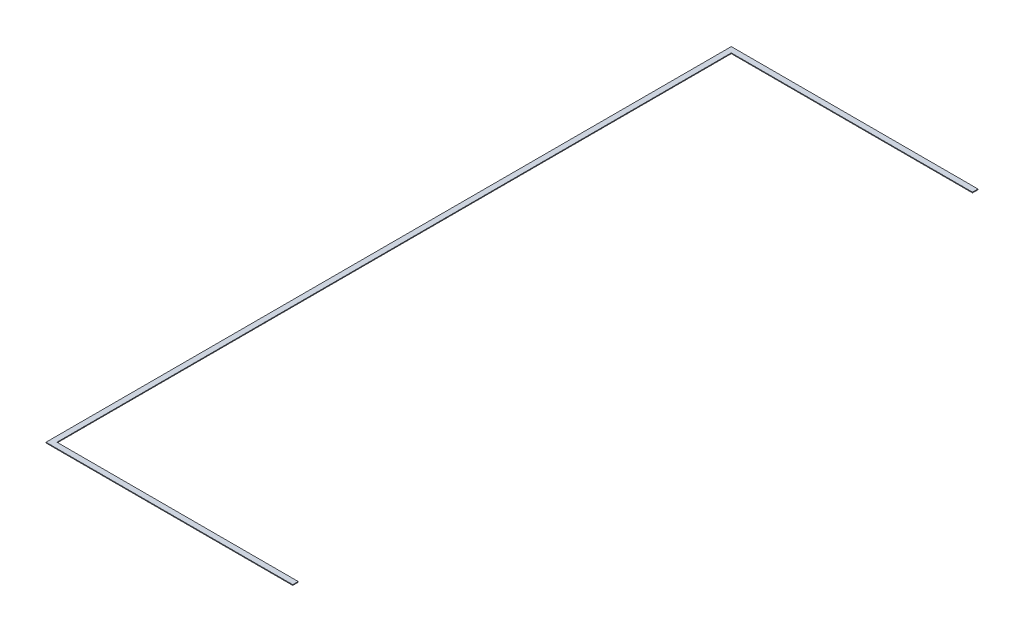
ISO-10303-21;
HEADER;
FILE_DESCRIPTION(('STEP AP214'),'2;1');
FILE_NAME('part.step','',(''),(''),'','','');
FILE_SCHEMA(('AUTOMOTIVE_DESIGN { 1 0 10303 214 1 1 1 1 }'));
ENDSEC;
DATA;
#1=APPLICATION_CONTEXT('core data for automotive mechanical design processes');
#2=APPLICATION_PROTOCOL_DEFINITION('international standard','automotive_design',2000,#1);
#3=PRODUCT_CONTEXT('',#1,'mechanical');
#4=PRODUCT('Part','Part','',(#3));
#5=PRODUCT_RELATED_PRODUCT_CATEGORY('part','',(#4));
#6=PRODUCT_DEFINITION_FORMATION('','',#4);
#7=PRODUCT_DEFINITION_CONTEXT('part definition',#1,'design');
#8=PRODUCT_DEFINITION('design','',#6,#7);
#9=PRODUCT_DEFINITION_SHAPE('','',#8);
#10=(LENGTH_UNIT() NAMED_UNIT(*) SI_UNIT(.MILLI.,.METRE.));
#11=(NAMED_UNIT(*) PLANE_ANGLE_UNIT() SI_UNIT($,.RADIAN.));
#12=(NAMED_UNIT(*) SI_UNIT($,.STERADIAN.) SOLID_ANGLE_UNIT());
#13=UNCERTAINTY_MEASURE_WITH_UNIT(LENGTH_MEASURE(1.E-05),#10,'distance_accuracy_value','');
#14=(GEOMETRIC_REPRESENTATION_CONTEXT(3) GLOBAL_UNCERTAINTY_ASSIGNED_CONTEXT((#13)) GLOBAL_UNIT_ASSIGNED_CONTEXT((#10,
#11,#12)) REPRESENTATION_CONTEXT('',''));
#15=CARTESIAN_POINT('',(0.,0.,0.));
#16=DIRECTION('',(0.,0.,1.));
#17=DIRECTION('',(1.,0.,0.));
#18=AXIS2_PLACEMENT_3D('',#15,#16,#17);
#19=CARTESIAN_POINT('',(-1780.13644859814,6.35,-3175.));
#20=DIRECTION('',(0.,1.,0.));
#21=DIRECTION('',(0.,0.,1.));
#22=AXIS2_PLACEMENT_3D('',#19,#20,#21);
#23=PLANE('',#22);
#24=DIRECTION('',(-1.,0.,0.));
#25=VECTOR('',#24,1.);
#26=CARTESIAN_POINT('',(0.,6.35,-6350.));
#27=LINE('',#26,#25);
#28=CARTESIAN_POINT('',(-2286.,6.35,-6350.));
#29=VERTEX_POINT('',#28);
#30=CARTESIAN_POINT('',(0.,6.35,-6350.));
#31=VERTEX_POINT('',#30);
#32=EDGE_CURVE('E92',#29,#31,#27,.F.);
#33=ORIENTED_EDGE('',*,*,#32,.F.);
#34=DIRECTION('',(0.,0.,1.));
#35=VECTOR('',#34,1.);
#36=CARTESIAN_POINT('',(-2286.,6.35,-6350.));
#37=LINE('',#36,#35);
#38=CARTESIAN_POINT('',(-2286.,6.35,0.));
#39=VERTEX_POINT('',#38);
#40=EDGE_CURVE('E78',#39,#29,#37,.F.);
#41=ORIENTED_EDGE('',*,*,#40,.F.);
#42=DIRECTION('',(1.,0.,0.));
#43=VECTOR('',#42,1.);
#44=CARTESIAN_POINT('',(-2286.,6.35,0.));
#45=LINE('',#44,#43);
#46=CARTESIAN_POINT('',(0.,6.35,0.));
#47=VERTEX_POINT('',#46);
#48=EDGE_CURVE('E19',#47,#39,#45,.F.);
#49=ORIENTED_EDGE('',*,*,#48,.F.);
#50=DIRECTION('',(0.,0.,-1.));
#51=VECTOR('',#50,1.);
#52=CARTESIAN_POINT('',(0.,6.35,0.));
#53=LINE('',#52,#51);
#54=CARTESIAN_POINT('',(0.,6.35,-50.8));
#55=VERTEX_POINT('',#54);
#56=EDGE_CURVE('E124',#55,#47,#53,.F.);
#57=ORIENTED_EDGE('',*,*,#56,.F.);
#58=DIRECTION('',(-1.,0.,0.));
#59=VECTOR('',#58,1.);
#60=CARTESIAN_POINT('',(0.,6.35,-50.8));
#61=LINE('',#60,#59);
#62=CARTESIAN_POINT('',(-2235.20000000002,6.35,-50.8000000000067));
#63=VERTEX_POINT('',#62);
#64=EDGE_CURVE('E121',#63,#55,#61,.F.);
#65=ORIENTED_EDGE('',*,*,#64,.F.);
#66=DIRECTION('',(0.,0.,-1.));
#67=VECTOR('',#66,1.);
#68=CARTESIAN_POINT('',(-2235.20000000002,6.35,-50.8000000000084));
#69=LINE('',#68,#67);
#70=CARTESIAN_POINT('',(-2235.20000000002,6.35,-6299.2));
#71=VERTEX_POINT('',#70);
#72=EDGE_CURVE('E116',#71,#63,#69,.F.);
#73=ORIENTED_EDGE('',*,*,#72,.F.);
#74=DIRECTION('',(1.,0.,0.));
#75=VECTOR('',#74,1.);
#76=CARTESIAN_POINT('',(-2235.20000000002,6.35,-6299.2));
#77=LINE('',#76,#75);
#78=CARTESIAN_POINT('',(0.,6.35,-6299.2));
#79=VERTEX_POINT('',#78);
#80=EDGE_CURVE('E111',#79,#71,#77,.F.);
#81=ORIENTED_EDGE('',*,*,#80,.F.);
#82=DIRECTION('',(0.,0.,-1.));
#83=VECTOR('',#82,1.);
#84=CARTESIAN_POINT('',(0.,6.35,-6299.2));
#85=LINE('',#84,#83);
#86=EDGE_CURVE('E106',#31,#79,#85,.F.);
#87=ORIENTED_EDGE('',*,*,#86,.F.);
#88=EDGE_LOOP('',(#33,#41,#49,#57,#65,#73,#81,#87));
#89=FACE_BOUND('',#88,.T.);
#90=ADVANCED_FACE('F16',(#89),#23,.T.);
#91=CARTESIAN_POINT('',(-2286.,0.,0.));
#92=DIRECTION('',(0.,0.,1.));
#93=DIRECTION('',(1.,0.,0.));
#94=AXIS2_PLACEMENT_3D('',#91,#92,#93);
#95=PLANE('',#94);
#96=ORIENTED_EDGE('',*,*,#48,.T.);
#97=DIRECTION('',(0.,1.,0.));
#98=VECTOR('',#97,1.);
#99=CARTESIAN_POINT('',(-2286.,0.,0.));
#100=LINE('',#99,#98);
#101=CARTESIAN_POINT('',(-2286.,0.,0.));
#102=VERTEX_POINT('',#101);
#103=EDGE_CURVE('E84',#102,#39,#100,.T.);
#104=ORIENTED_EDGE('',*,*,#103,.F.);
#105=DIRECTION('',(1.,0.,0.));
#106=VECTOR('',#105,1.);
#107=CARTESIAN_POINT('',(-1780.13644859814,0.,0.));
#108=LINE('',#107,#106);
#109=CARTESIAN_POINT('',(0.,0.,0.));
#110=VERTEX_POINT('',#109);
#111=EDGE_CURVE('E127',#110,#102,#108,.F.);
#112=ORIENTED_EDGE('',*,*,#111,.F.);
#113=DIRECTION('',(0.,1.,0.));
#114=VECTOR('',#113,1.);
#115=CARTESIAN_POINT('',(0.,0.,0.));
#116=LINE('',#115,#114);
#117=EDGE_CURVE('E87',#47,#110,#116,.F.);
#118=ORIENTED_EDGE('',*,*,#117,.F.);
#119=EDGE_LOOP('',(#96,#104,#112,#118));
#120=FACE_BOUND('',#119,.T.);
#121=ADVANCED_FACE('F83',(#120),#95,.T.);
#122=CARTESIAN_POINT('',(-2286.,0.,-6350.));
#123=DIRECTION('',(-1.,0.,0.));
#124=DIRECTION('',(0.,0.,1.));
#125=AXIS2_PLACEMENT_3D('',#122,#123,#124);
#126=PLANE('',#125);
#127=ORIENTED_EDGE('',*,*,#40,.T.);
#128=DIRECTION('',(0.,1.,0.));
#129=VECTOR('',#128,1.);
#130=CARTESIAN_POINT('',(-2286.,0.,-6350.));
#131=LINE('',#130,#129);
#132=CARTESIAN_POINT('',(-2286.,0.,-6350.));
#133=VERTEX_POINT('',#132);
#134=EDGE_CURVE('E94',#133,#29,#131,.T.);
#135=ORIENTED_EDGE('',*,*,#134,.F.);
#136=DIRECTION('',(0.,0.,-1.));
#137=VECTOR('',#136,1.);
#138=CARTESIAN_POINT('',(-2286.,0.,-3175.));
#139=LINE('',#138,#137);
#140=EDGE_CURVE('E98',#102,#133,#139,.T.);
#141=ORIENTED_EDGE('',*,*,#140,.F.);
#142=ORIENTED_EDGE('',*,*,#103,.T.);
#143=EDGE_LOOP('',(#127,#135,#141,#142));
#144=FACE_BOUND('',#143,.T.);
#145=ADVANCED_FACE('F96',(#144),#126,.T.);
#146=CARTESIAN_POINT('',(0.,0.,-6350.));
#147=DIRECTION('',(0.,0.,-1.));
#148=DIRECTION('',(-1.,0.,0.));
#149=AXIS2_PLACEMENT_3D('',#146,#147,#148);
#150=PLANE('',#149);
#151=ORIENTED_EDGE('',*,*,#32,.T.);
#152=DIRECTION('',(0.,1.,0.));
#153=VECTOR('',#152,1.);
#154=CARTESIAN_POINT('',(0.,0.,-6350.));
#155=LINE('',#154,#153);
#156=CARTESIAN_POINT('',(0.,0.,-6350.));
#157=VERTEX_POINT('',#156);
#158=EDGE_CURVE('E103',#157,#31,#155,.T.);
#159=ORIENTED_EDGE('',*,*,#158,.F.);
#160=DIRECTION('',(1.,0.,0.));
#161=VECTOR('',#160,1.);
#162=CARTESIAN_POINT('',(-1780.13644859814,0.,-6350.));
#163=LINE('',#162,#161);
#164=EDGE_CURVE('E130',#133,#157,#163,.T.);
#165=ORIENTED_EDGE('',*,*,#164,.F.);
#166=ORIENTED_EDGE('',*,*,#134,.T.);
#167=EDGE_LOOP('',(#151,#159,#165,#166));
#168=FACE_BOUND('',#167,.T.);
#169=ADVANCED_FACE('F173',(#168),#150,.T.);
#170=CARTESIAN_POINT('',(0.,0.,-6299.2));
#171=DIRECTION('',(1.,0.,0.));
#172=DIRECTION('',(0.,0.,-1.));
#173=AXIS2_PLACEMENT_3D('',#170,#171,#172);
#174=PLANE('',#173);
#175=ORIENTED_EDGE('',*,*,#86,.T.);
#176=DIRECTION('',(0.,1.,0.));
#177=VECTOR('',#176,1.);
#178=CARTESIAN_POINT('',(0.,0.,-6299.20000000001));
#179=LINE('',#178,#177);
#180=CARTESIAN_POINT('',(0.,0.,-6299.2));
#181=VERTEX_POINT('',#180);
#182=EDGE_CURVE('E108',#181,#79,#179,.T.);
#183=ORIENTED_EDGE('',*,*,#182,.F.);
#184=DIRECTION('',(0.,0.,-1.));
#185=VECTOR('',#184,1.);
#186=CARTESIAN_POINT('',(0.,0.,-3175.));
#187=LINE('',#186,#185);
#188=EDGE_CURVE('E133',#157,#181,#187,.F.);
#189=ORIENTED_EDGE('',*,*,#188,.F.);
#190=ORIENTED_EDGE('',*,*,#158,.T.);
#191=EDGE_LOOP('',(#175,#183,#189,#190));
#192=FACE_BOUND('',#191,.T.);
#193=ADVANCED_FACE('F169',(#192),#174,.T.);
#194=CARTESIAN_POINT('',(-2235.20000000002,0.,-6299.2));
#195=DIRECTION('',(0.,0.,1.));
#196=DIRECTION('',(1.,0.,0.));
#197=AXIS2_PLACEMENT_3D('',#194,#195,#196);
#198=PLANE('',#197);
#199=ORIENTED_EDGE('',*,*,#80,.T.);
#200=DIRECTION('',(0.,1.,0.));
#201=VECTOR('',#200,1.);
#202=CARTESIAN_POINT('',(-2235.20000000002,0.,-6299.2));
#203=LINE('',#202,#201);
#204=CARTESIAN_POINT('',(-2235.20000000002,0.,-6299.2));
#205=VERTEX_POINT('',#204);
#206=EDGE_CURVE('E113',#205,#71,#203,.T.);
#207=ORIENTED_EDGE('',*,*,#206,.F.);
#208=DIRECTION('',(1.,0.,0.));
#209=VECTOR('',#208,1.);
#210=CARTESIAN_POINT('',(-1780.13644859814,0.,-6299.2));
#211=LINE('',#210,#209);
#212=EDGE_CURVE('E136',#181,#205,#211,.F.);
#213=ORIENTED_EDGE('',*,*,#212,.F.);
#214=ORIENTED_EDGE('',*,*,#182,.T.);
#215=EDGE_LOOP('',(#199,#207,#213,#214));
#216=FACE_BOUND('',#215,.T.);
#217=ADVANCED_FACE('F166',(#216),#198,.T.);
#218=CARTESIAN_POINT('',(-2235.20000000002,0.,-50.8000000000084));
#219=DIRECTION('',(1.,0.,0.));
#220=DIRECTION('',(0.,0.,-1.));
#221=AXIS2_PLACEMENT_3D('',#218,#219,#220);
#222=PLANE('',#221);
#223=ORIENTED_EDGE('',*,*,#72,.T.);
#224=DIRECTION('',(0.,1.,0.));
#225=VECTOR('',#224,1.);
#226=CARTESIAN_POINT('',(-2235.20000000002,0.,-50.8000000000087));
#227=LINE('',#226,#225);
#228=CARTESIAN_POINT('',(-2235.20000000002,0.,-50.8000000000089));
#229=VERTEX_POINT('',#228);
#230=EDGE_CURVE('E118',#229,#63,#227,.T.);
#231=ORIENTED_EDGE('',*,*,#230,.F.);
#232=DIRECTION('',(0.,0.,-1.));
#233=VECTOR('',#232,1.);
#234=CARTESIAN_POINT('',(-2235.20000000002,0.,-3175.));
#235=LINE('',#234,#233);
#236=EDGE_CURVE('E139',#205,#229,#235,.F.);
#237=ORIENTED_EDGE('',*,*,#236,.F.);
#238=ORIENTED_EDGE('',*,*,#206,.T.);
#239=EDGE_LOOP('',(#223,#231,#237,#238));
#240=FACE_BOUND('',#239,.T.);
#241=ADVANCED_FACE('F149',(#240),#222,.T.);
#242=CARTESIAN_POINT('',(0.,0.,-50.8));
#243=DIRECTION('',(0.,0.,-1.));
#244=DIRECTION('',(-1.,0.,0.));
#245=AXIS2_PLACEMENT_3D('',#242,#243,#244);
#246=PLANE('',#245);
#247=ORIENTED_EDGE('',*,*,#64,.T.);
#248=DIRECTION('',(0.,1.,0.));
#249=VECTOR('',#248,1.);
#250=CARTESIAN_POINT('',(0.,0.,-50.8));
#251=LINE('',#250,#249);
#252=CARTESIAN_POINT('',(0.,0.,-50.8000000000023));
#253=VERTEX_POINT('',#252);
#254=EDGE_CURVE('E34',#253,#55,#251,.T.);
#255=ORIENTED_EDGE('',*,*,#254,.F.);
#256=DIRECTION('',(1.,0.,0.));
#257=VECTOR('',#256,1.);
#258=CARTESIAN_POINT('',(-1780.13644859814,0.,-50.8000000000091));
#259=LINE('',#258,#257);
#260=EDGE_CURVE('E25',#229,#253,#259,.T.);
#261=ORIENTED_EDGE('',*,*,#260,.F.);
#262=ORIENTED_EDGE('',*,*,#230,.T.);
#263=EDGE_LOOP('',(#247,#255,#261,#262));
#264=FACE_BOUND('',#263,.T.);
#265=ADVANCED_FACE('F146',(#264),#246,.T.);
#266=CARTESIAN_POINT('',(0.,0.,0.));
#267=DIRECTION('',(1.,0.,0.));
#268=DIRECTION('',(0.,0.,-1.));
#269=AXIS2_PLACEMENT_3D('',#266,#267,#268);
#270=PLANE('',#269);
#271=ORIENTED_EDGE('',*,*,#56,.T.);
#272=ORIENTED_EDGE('',*,*,#117,.T.);
#273=DIRECTION('',(0.,0.,-1.));
#274=VECTOR('',#273,1.);
#275=CARTESIAN_POINT('',(0.,0.,-3175.));
#276=LINE('',#275,#274);
#277=EDGE_CURVE('E11',#253,#110,#276,.F.);
#278=ORIENTED_EDGE('',*,*,#277,.F.);
#279=ORIENTED_EDGE('',*,*,#254,.T.);
#280=EDGE_LOOP('',(#271,#272,#278,#279));
#281=FACE_BOUND('',#280,.T.);
#282=ADVANCED_FACE('F153',(#281),#270,.T.);
#283=CARTESIAN_POINT('',(-1780.13644859814,0.,-3175.));
#284=DIRECTION('',(0.,-1.,0.));
#285=DIRECTION('',(0.,0.,-1.));
#286=AXIS2_PLACEMENT_3D('',#283,#284,#285);
#287=PLANE('',#286);
#288=ORIENTED_EDGE('',*,*,#260,.T.);
#289=ORIENTED_EDGE('',*,*,#277,.T.);
#290=ORIENTED_EDGE('',*,*,#111,.T.);
#291=ORIENTED_EDGE('',*,*,#140,.T.);
#292=ORIENTED_EDGE('',*,*,#164,.T.);
#293=ORIENTED_EDGE('',*,*,#188,.T.);
#294=ORIENTED_EDGE('',*,*,#212,.T.);
#295=ORIENTED_EDGE('',*,*,#236,.T.);
#296=EDGE_LOOP('',(#288,#289,#290,#291,#292,#293,#294,#295));
#297=FACE_BOUND('',#296,.T.);
#298=ADVANCED_FACE('F144',(#297),#287,.T.);
#299=CLOSED_SHELL('',(#90,#121,#145,#169,#193,#217,#241,#265,#282,#298));
#300=MANIFOLD_SOLID_BREP('B1',#299);
#301=ADVANCED_BREP_SHAPE_REPRESENTATION('',(#18,#300),#14);
#302=SHAPE_DEFINITION_REPRESENTATION(#9,#301);
ENDSEC;
END-ISO-10303-21;
